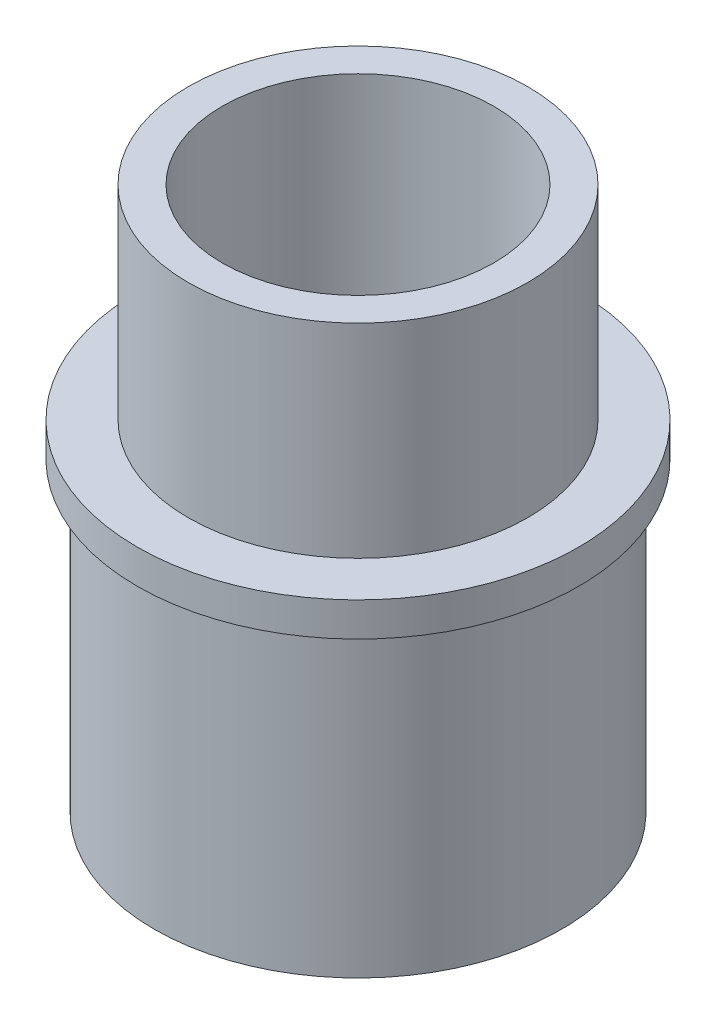
ISO-10303-21;
HEADER;
FILE_DESCRIPTION(('STEP AP214'),'2;1');
FILE_NAME('part.step','',(''),(''),'','','');
FILE_SCHEMA(('AUTOMOTIVE_DESIGN { 1 0 10303 214 1 1 1 1 }'));
ENDSEC;
DATA;
#1=APPLICATION_CONTEXT('core data for automotive mechanical design processes');
#2=APPLICATION_PROTOCOL_DEFINITION('international standard','automotive_design',2000,#1);
#3=PRODUCT_CONTEXT('',#1,'mechanical');
#4=PRODUCT('Part','Part','',(#3));
#5=PRODUCT_RELATED_PRODUCT_CATEGORY('part','',(#4));
#6=PRODUCT_DEFINITION_FORMATION('','',#4);
#7=PRODUCT_DEFINITION_CONTEXT('part definition',#1,'design');
#8=PRODUCT_DEFINITION('design','',#6,#7);
#9=PRODUCT_DEFINITION_SHAPE('','',#8);
#10=(LENGTH_UNIT() NAMED_UNIT(*) SI_UNIT(.MILLI.,.METRE.));
#11=(NAMED_UNIT(*) PLANE_ANGLE_UNIT() SI_UNIT($,.RADIAN.));
#12=(NAMED_UNIT(*) SI_UNIT($,.STERADIAN.) SOLID_ANGLE_UNIT());
#13=UNCERTAINTY_MEASURE_WITH_UNIT(LENGTH_MEASURE(1.E-05),#10,'distance_accuracy_value','');
#14=(GEOMETRIC_REPRESENTATION_CONTEXT(3) GLOBAL_UNCERTAINTY_ASSIGNED_CONTEXT((#13)) GLOBAL_UNIT_ASSIGNED_CONTEXT((#10,
#11,#12)) REPRESENTATION_CONTEXT('',''));
#15=CARTESIAN_POINT('',(0.,0.,0.));
#16=DIRECTION('',(0.,0.,1.));
#17=DIRECTION('',(1.,0.,0.));
#18=AXIS2_PLACEMENT_3D('',#15,#16,#17);
#19=CARTESIAN_POINT('',(0.,0.,0.));
#20=DIRECTION('',(0.,-1.,0.));
#21=DIRECTION('',(0.,0.,-1.));
#22=AXIS2_PLACEMENT_3D('',#19,#20,#21);
#23=CYLINDRICAL_SURFACE('',#22,5.5);
#24=CARTESIAN_POINT('',(0.,9.,0.));
#25=DIRECTION('',(0.,-1.,0.));
#26=DIRECTION('',(0.,0.,-1.));
#27=AXIS2_PLACEMENT_3D('',#24,#25,#26);
#28=CIRCLE('',#27,5.5);
#29=CARTESIAN_POINT('',(0.,9.,-5.5));
#30=VERTEX_POINT('',#29);
#31=EDGE_CURVE('P0_E21',#30,#30,#28,.T.);
#32=ORIENTED_EDGE('',*,*,#31,.T.);
#33=EDGE_LOOP('',(#32));
#34=FACE_BOUND('',#33,.T.);
#35=CARTESIAN_POINT('',(0.,0.,0.));
#36=DIRECTION('',(0.,-1.,0.));
#37=DIRECTION('',(0.,0.,-1.));
#38=AXIS2_PLACEMENT_3D('',#35,#36,#37);
#39=CIRCLE('',#38,5.5);
#40=CARTESIAN_POINT('',(0.,0.,-5.5));
#41=VERTEX_POINT('',#40);
#42=EDGE_CURVE('P0_E11',#41,#41,#39,.F.);
#43=ORIENTED_EDGE('',*,*,#42,.T.);
#44=EDGE_LOOP('',(#43));
#45=FACE_BOUND('',#44,.T.);
#46=ADVANCED_FACE('P0_F17',(#34,#45),#23,.T.);
#47=CARTESIAN_POINT('',(0.,9.,0.));
#48=DIRECTION('',(0.,-1.,0.));
#49=DIRECTION('',(0.,0.,-1.));
#50=AXIS2_PLACEMENT_3D('',#47,#48,#49);
#51=PLANE('',#50);
#52=ORIENTED_EDGE('',*,*,#31,.F.);
#53=EDGE_LOOP('',(#52));
#54=FACE_BOUND('',#53,.T.);
#55=CARTESIAN_POINT('',(-6.,9.,0.));
#56=CARTESIAN_POINT('',(-5.9999026377586,9.,-0.550743840355818));
#57=CARTESIAN_POINT('',(-5.89983221049945,9.,-1.09177831447287));
#58=CARTESIAN_POINT('',(-5.79375486108577,9.,-1.66528943586673));
#59=CARTESIAN_POINT('',(-5.57872980637458,9.,-2.20856825737124));
#60=CARTESIAN_POINT('',(-5.35506877340283,9.,-2.7736666017134));
#61=CARTESIAN_POINT('',(-5.02197306731191,9.,-3.28325852031085));
#62=CARTESIAN_POINT('',(-4.68231976838645,9.,-3.80288267965122));
#63=CARTESIAN_POINT('',(-4.24264068711928,9.,-4.24264068711929));
#64=CARTESIAN_POINT('',(-3.80371897722524,9.,-4.68164118725951));
#65=CARTESIAN_POINT('',(-3.28325852031085,9.,-5.02197306731191));
#66=CARTESIAN_POINT('',(-2.77460365923911,9.,-5.35458520501906));
#67=CARTESIAN_POINT('',(-2.20856825737124,9.,-5.57872980637458));
#68=CARTESIAN_POINT('',(-1.66629833404012,9.,-5.79346350569983));
#69=CARTESIAN_POINT('',(-1.09177831447287,9.,-5.89983221049945));
#70=CARTESIAN_POINT('',(-0.551013824548364,9.,-5.99995129501494));
#71=CARTESIAN_POINT('',(0.,9.,-6.));
#72=CARTESIAN_POINT('',(0.549954628663815,9.,-6.00004861136106));
#73=CARTESIAN_POINT('',(1.09177831447287,9.,-5.89983221049945));
#74=CARTESIAN_POINT('',(1.66528943586532,9.,-5.79375486108598));
#75=CARTESIAN_POINT('',(2.20856825737124,9.,-5.57872980637458));
#76=CARTESIAN_POINT('',(2.77366660171434,9.,-5.35506877340282));
#77=CARTESIAN_POINT('',(3.28325852031086,9.,-5.02197306731191));
#78=CARTESIAN_POINT('',(3.80288267965448,9.,-4.6823197683837));
#79=CARTESIAN_POINT('',(4.24264068711929,9.,-4.24264068711928));
#80=CARTESIAN_POINT('',(4.68164118725577,9.,-3.80371897722848));
#81=CARTESIAN_POINT('',(5.02197306731191,9.,-3.28325852031085));
#82=CARTESIAN_POINT('',(5.35458520501688,9.,-2.77460365924488));
#83=CARTESIAN_POINT('',(5.57872980637458,9.,-2.20856825737124));
#84=CARTESIAN_POINT('',(5.7934635056995,9.,-1.66629833404071));
#85=CARTESIAN_POINT('',(5.89983221049945,9.,-1.09177831447287));
#86=CARTESIAN_POINT('',(5.99990254347984,9.,-0.55127714196929));
#87=CARTESIAN_POINT('',(6.,9.,0.));
#88=B_SPLINE_CURVE_WITH_KNOTS('',2,(#55,#56,#57,#58,#59,#60,#61,#62,#63,#64,#65,#66,#67,#68,#69,
#70,#71,#72,#73,#74,#75,#76,#77,#78,#79,#80,#81,#82,#83,#84,#85,#86,#87),.UNSPECIFIED.,.F.,.F.,
(3,2,2,2,2,2,2,2,2,2,2,2,2,2,2,2,3),(0.,0.0625,0.125,0.1875,0.25,0.3125,0.375,0.4375,0.5,0.5625,
0.625,0.6875,0.75,0.8125,0.875,0.9375,1.),.UNSPECIFIED.);
#89=CARTESIAN_POINT('',(-6.,9.,0.));
#90=VERTEX_POINT('',#89);
#91=CARTESIAN_POINT('',(6.,9.,0.));
#92=VERTEX_POINT('',#91);
#93=EDGE_CURVE('P0_E31',#90,#92,#88,.T.);
#94=ORIENTED_EDGE('',*,*,#93,.T.);
#95=CARTESIAN_POINT('',(6.,9.,0.));
#96=CARTESIAN_POINT('',(5.9999026377586,9.,0.550743840355818));
#97=CARTESIAN_POINT('',(5.89983221049945,9.,1.09177831447287));
#98=CARTESIAN_POINT('',(5.79375486108577,9.,1.66528943586673));
#99=CARTESIAN_POINT('',(5.57872980637458,9.,2.20856825737124));
#100=CARTESIAN_POINT('',(5.35506877340283,9.,2.7736666017134));
#101=CARTESIAN_POINT('',(5.02197306731191,9.,3.28325852031085));
#102=CARTESIAN_POINT('',(4.68231976838645,9.,3.80288267965122));
#103=CARTESIAN_POINT('',(4.24264068711928,9.,4.24264068711929));
#104=CARTESIAN_POINT('',(3.80371897722524,9.,4.68164118725951));
#105=CARTESIAN_POINT('',(3.28325852031085,9.,5.02197306731191));
#106=CARTESIAN_POINT('',(2.77460365923911,9.,5.35458520501906));
#107=CARTESIAN_POINT('',(2.20856825737124,9.,5.57872980637458));
#108=CARTESIAN_POINT('',(1.66629833404012,9.,5.79346350569983));
#109=CARTESIAN_POINT('',(1.09177831447287,9.,5.89983221049945));
#110=CARTESIAN_POINT('',(0.551013824548364,9.,5.99995129501494));
#111=CARTESIAN_POINT('',(0.,9.,6.));
#112=CARTESIAN_POINT('',(-0.549954628663815,9.,6.00004861136106));
#113=CARTESIAN_POINT('',(-1.09177831447287,9.,5.89983221049945));
#114=CARTESIAN_POINT('',(-1.66528943586532,9.,5.79375486108598));
#115=CARTESIAN_POINT('',(-2.20856825737124,9.,5.57872980637458));
#116=CARTESIAN_POINT('',(-2.77366660171434,9.,5.35506877340282));
#117=CARTESIAN_POINT('',(-3.28325852031086,9.,5.02197306731191));
#118=CARTESIAN_POINT('',(-3.80288267965448,9.,4.6823197683837));
#119=CARTESIAN_POINT('',(-4.24264068711929,9.,4.24264068711928));
#120=CARTESIAN_POINT('',(-4.68164118725577,9.,3.80371897722848));
#121=CARTESIAN_POINT('',(-5.02197306731191,9.,3.28325852031085));
#122=CARTESIAN_POINT('',(-5.35458520501688,9.,2.77460365924488));
#123=CARTESIAN_POINT('',(-5.57872980637458,9.,2.20856825737124));
#124=CARTESIAN_POINT('',(-5.7934635056995,9.,1.66629833404071));
#125=CARTESIAN_POINT('',(-5.89983221049945,9.,1.09177831447287));
#126=CARTESIAN_POINT('',(-5.99990254347984,9.,0.55127714196929));
#127=CARTESIAN_POINT('',(-6.,9.,0.));
#128=B_SPLINE_CURVE_WITH_KNOTS('',2,(#95,#96,#97,#98,#99,#100,#101,#102,#103,#104,#105,#106,
#107,#108,#109,#110,#111,#112,#113,#114,#115,#116,#117,#118,#119,#120,#121,#122,#123,#124,#125,
#126,#127),.UNSPECIFIED.,.F.,.F.,(3,2,2,2,2,2,2,2,2,2,2,2,2,2,2,2,3),(0.,0.0625,0.125,0.1875,
0.25,0.3125,0.375,0.4375,0.5,0.5625,0.625,0.6875,0.75,0.8125,0.875,0.9375,1.),.UNSPECIFIED.);
#129=EDGE_CURVE('P0_E34',#92,#90,#128,.T.);
#130=ORIENTED_EDGE('',*,*,#129,.T.);
#131=EDGE_LOOP('',(#94,#130));
#132=FACE_BOUND('',#131,.T.);
#133=ADVANCED_FACE('P0_F18',(#54,#132),#51,.T.);
#134=OPEN_SHELL('',(#46,#133));
#135=SHELL_BASED_SURFACE_MODEL('P0_B1',(#134));
#136=CARTESIAN_POINT('',(0.,0.,0.));
#137=DIRECTION('',(0.,1.,0.));
#138=DIRECTION('',(0.,0.,1.));
#139=AXIS2_PLACEMENT_3D('',#136,#137,#138);
#140=CYLINDRICAL_SURFACE('',#139,6.5);
#141=CARTESIAN_POINT('',(0.,10.,0.));
#142=DIRECTION('',(0.,1.,0.));
#143=DIRECTION('',(0.,0.,1.));
#144=AXIS2_PLACEMENT_3D('',#141,#142,#143);
#145=CIRCLE('',#144,6.5);
#146=CARTESIAN_POINT('',(0.,10.,6.5));
#147=VERTEX_POINT('',#146);
#148=EDGE_CURVE('P1_E40',#147,#147,#145,.T.);
#149=ORIENTED_EDGE('',*,*,#148,.F.);
#150=EDGE_LOOP('',(#149));
#151=FACE_BOUND('',#150,.T.);
#152=CARTESIAN_POINT('',(0.,9.,0.));
#153=DIRECTION('',(0.,1.,0.));
#154=DIRECTION('',(0.,0.,1.));
#155=AXIS2_PLACEMENT_3D('',#152,#153,#154);
#156=CIRCLE('',#155,6.5);
#157=CARTESIAN_POINT('',(0.,9.,6.5));
#158=VERTEX_POINT('',#157);
#159=EDGE_CURVE('P1_E18',#158,#158,#156,.F.);
#160=ORIENTED_EDGE('',*,*,#159,.F.);
#161=EDGE_LOOP('',(#160));
#162=FACE_BOUND('',#161,.T.);
#163=ADVANCED_FACE('P1_F15',(#151,#162),#140,.T.);
#164=CARTESIAN_POINT('',(0.,9.,0.));
#165=DIRECTION('',(0.,-1.,0.));
#166=DIRECTION('',(0.,0.,-1.));
#167=AXIS2_PLACEMENT_3D('',#164,#165,#166);
#168=PLANE('',#167);
#169=CARTESIAN_POINT('',(0.,9.,0.));
#170=DIRECTION('',(0.,-1.,0.));
#171=DIRECTION('',(0.,0.,-1.));
#172=AXIS2_PLACEMENT_3D('',#169,#170,#171);
#173=CIRCLE('',#172,6.);
#174=CARTESIAN_POINT('',(0.,9.,-6.));
#175=VERTEX_POINT('',#174);
#176=EDGE_CURVE('P1_E38',#175,#175,#173,.T.);
#177=ORIENTED_EDGE('',*,*,#176,.F.);
#178=EDGE_LOOP('',(#177));
#179=FACE_BOUND('',#178,.T.);
#180=ORIENTED_EDGE('',*,*,#159,.T.);
#181=EDGE_LOOP('',(#180));
#182=FACE_BOUND('',#181,.T.);
#183=ADVANCED_FACE('P1_F47',(#179,#182),#168,.T.);
#184=CARTESIAN_POINT('',(0.,10.,0.));
#185=DIRECTION('',(0.,1.,0.));
#186=DIRECTION('',(0.,0.,1.));
#187=AXIS2_PLACEMENT_3D('',#184,#185,#186);
#188=PLANE('',#187);
#189=CARTESIAN_POINT('',(0.,10.,0.));
#190=DIRECTION('',(0.,1.,0.));
#191=DIRECTION('',(0.,0.,1.));
#192=AXIS2_PLACEMENT_3D('',#189,#190,#191);
#193=CIRCLE('',#192,5.);
#194=CARTESIAN_POINT('',(0.,10.,5.));
#195=VERTEX_POINT('',#194);
#196=EDGE_CURVE('P1_E35',#195,#195,#193,.T.);
#197=ORIENTED_EDGE('',*,*,#196,.F.);
#198=EDGE_LOOP('',(#197));
#199=FACE_BOUND('',#198,.T.);
#200=ORIENTED_EDGE('',*,*,#148,.T.);
#201=EDGE_LOOP('',(#200));
#202=FACE_BOUND('',#201,.T.);
#203=ADVANCED_FACE('P1_F55',(#199,#202),#188,.T.);
#204=CARTESIAN_POINT('',(0.,0.,0.));
#205=DIRECTION('',(0.,-1.,0.));
#206=DIRECTION('',(0.,0.,-1.));
#207=AXIS2_PLACEMENT_3D('',#204,#205,#206);
#208=CYLINDRICAL_SURFACE('',#207,6.);
#209=ORIENTED_EDGE('',*,*,#176,.T.);
#210=EDGE_LOOP('',(#209));
#211=FACE_BOUND('',#210,.T.);
#212=CARTESIAN_POINT('',(0.,0.,0.));
#213=DIRECTION('',(0.,-1.,0.));
#214=DIRECTION('',(0.,0.,-1.));
#215=AXIS2_PLACEMENT_3D('',#212,#213,#214);
#216=CIRCLE('',#215,6.);
#217=CARTESIAN_POINT('',(0.,0.,-6.));
#218=VERTEX_POINT('',#217);
#219=EDGE_CURVE('P1_E32',#218,#218,#216,.F.);
#220=ORIENTED_EDGE('',*,*,#219,.T.);
#221=EDGE_LOOP('',(#220));
#222=FACE_BOUND('',#221,.T.);
#223=ADVANCED_FACE('P1_F75',(#211,#222),#208,.T.);
#224=CARTESIAN_POINT('',(0.,16.,0.));
#225=DIRECTION('',(0.,1.,0.));
#226=DIRECTION('',(0.,0.,1.));
#227=AXIS2_PLACEMENT_3D('',#224,#225,#226);
#228=CYLINDRICAL_SURFACE('',#227,5.);
#229=ORIENTED_EDGE('',*,*,#196,.T.);
#230=EDGE_LOOP('',(#229));
#231=FACE_BOUND('',#230,.T.);
#232=CARTESIAN_POINT('',(0.,16.,0.));
#233=DIRECTION('',(0.,1.,0.));
#234=DIRECTION('',(0.,0.,1.));
#235=AXIS2_PLACEMENT_3D('',#232,#233,#234);
#236=CIRCLE('',#235,5.);
#237=CARTESIAN_POINT('',(0.,16.,5.));
#238=VERTEX_POINT('',#237);
#239=EDGE_CURVE('P1_E27',#238,#238,#236,.T.);
#240=ORIENTED_EDGE('',*,*,#239,.F.);
#241=EDGE_LOOP('',(#240));
#242=FACE_BOUND('',#241,.T.);
#243=ADVANCED_FACE('P1_F71',(#231,#242),#228,.T.);
#244=CARTESIAN_POINT('',(0.,0.,0.));
#245=DIRECTION('',(0.,1.,0.));
#246=DIRECTION('',(0.,0.,1.));
#247=AXIS2_PLACEMENT_3D('',#244,#245,#246);
#248=PLANE('',#247);
#249=CARTESIAN_POINT('',(0.,0.,0.));
#250=DIRECTION('',(0.,1.,0.));
#251=DIRECTION('',(0.,0.,1.));
#252=AXIS2_PLACEMENT_3D('',#249,#250,#251);
#253=CIRCLE('',#252,4.);
#254=CARTESIAN_POINT('',(0.,0.,4.));
#255=VERTEX_POINT('',#254);
#256=EDGE_CURVE('P1_E22',#255,#255,#253,.T.);
#257=ORIENTED_EDGE('',*,*,#256,.T.);
#258=EDGE_LOOP('',(#257));
#259=FACE_BOUND('',#258,.T.);
#260=ORIENTED_EDGE('',*,*,#219,.F.);
#261=EDGE_LOOP('',(#260));
#262=FACE_BOUND('',#261,.T.);
#263=ADVANCED_FACE('P1_F65',(#259,#262),#248,.F.);
#264=CARTESIAN_POINT('',(0.,16.,0.));
#265=DIRECTION('',(0.,1.,0.));
#266=DIRECTION('',(0.,0.,1.));
#267=AXIS2_PLACEMENT_3D('',#264,#265,#266);
#268=PLANE('',#267);
#269=CARTESIAN_POINT('',(0.,16.,0.));
#270=DIRECTION('',(0.,1.,0.));
#271=DIRECTION('',(0.,0.,1.));
#272=AXIS2_PLACEMENT_3D('',#269,#270,#271);
#273=CIRCLE('',#272,4.);
#274=CARTESIAN_POINT('',(0.,16.,4.));
#275=VERTEX_POINT('',#274);
#276=EDGE_CURVE('P1_E10',#275,#275,#273,.F.);
#277=ORIENTED_EDGE('',*,*,#276,.T.);
#278=EDGE_LOOP('',(#277));
#279=FACE_BOUND('',#278,.T.);
#280=ORIENTED_EDGE('',*,*,#239,.T.);
#281=EDGE_LOOP('',(#280));
#282=FACE_BOUND('',#281,.T.);
#283=ADVANCED_FACE('P1_F59',(#279,#282),#268,.T.);
#284=CARTESIAN_POINT('',(0.,0.,0.));
#285=DIRECTION('',(0.,1.,0.));
#286=DIRECTION('',(0.,0.,1.));
#287=AXIS2_PLACEMENT_3D('',#284,#285,#286);
#288=CYLINDRICAL_SURFACE('',#287,4.);
#289=ORIENTED_EDGE('',*,*,#276,.F.);
#290=EDGE_LOOP('',(#289));
#291=FACE_BOUND('',#290,.T.);
#292=ORIENTED_EDGE('',*,*,#256,.F.);
#293=EDGE_LOOP('',(#292));
#294=FACE_BOUND('',#293,.T.);
#295=ADVANCED_FACE('P1_F57',(#291,#294),#288,.F.);
#296=CLOSED_SHELL('',(#163,#183,#203,#223,#243,#263,#283,#295));
#297=MANIFOLD_SOLID_BREP('P1_B1',#296);
#298=ADVANCED_BREP_SHAPE_REPRESENTATION('',(#18,#297),#14);
#299=MANIFOLD_SURFACE_SHAPE_REPRESENTATION('',(#18,#135),#14);
#300=SHAPE_REPRESENTATION('',(#18),#14);
#301=SHAPE_DEFINITION_REPRESENTATION(#9,#300);
#302=SHAPE_REPRESENTATION_RELATIONSHIP('','',#300,#298);
#303=SHAPE_REPRESENTATION_RELATIONSHIP('','',#300,#299);
ENDSEC;
END-ISO-10303-21;
